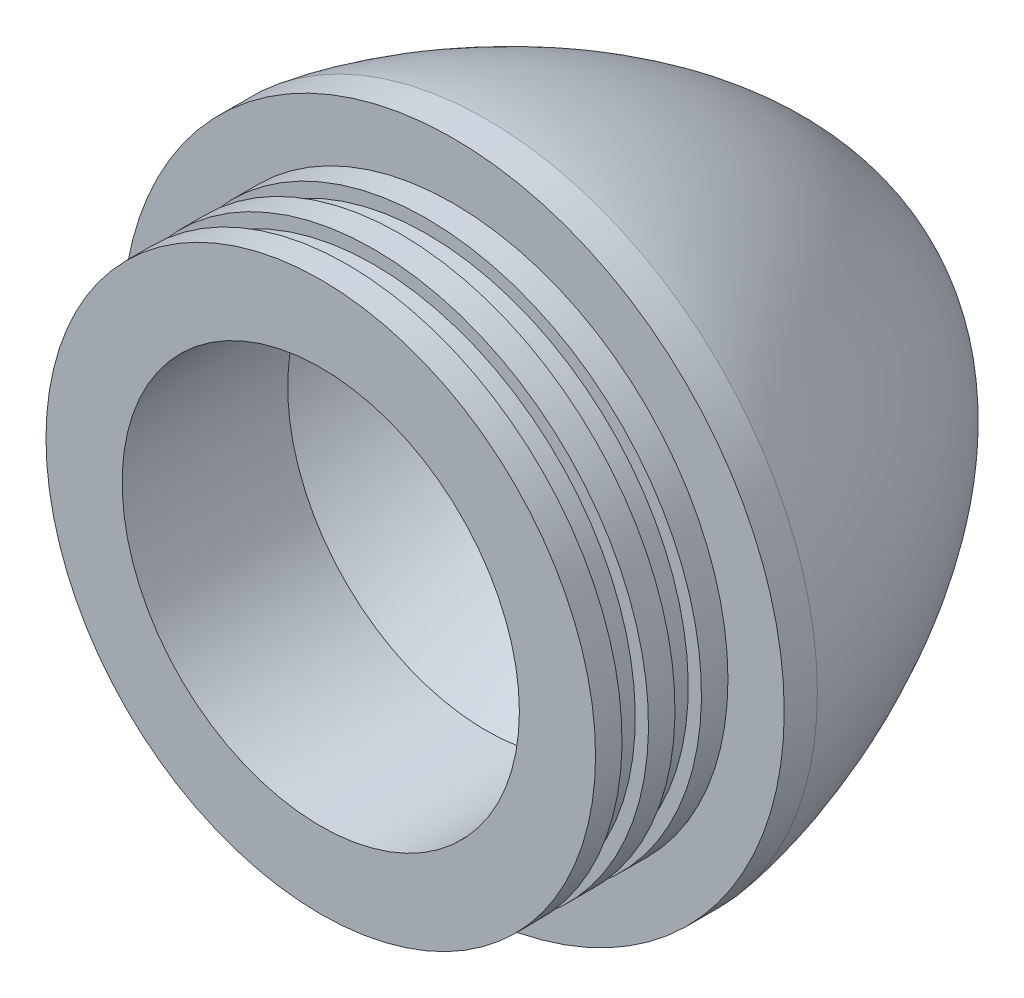
ISO-10303-21;
HEADER;
FILE_DESCRIPTION(('STEP AP214'),'2;1');
FILE_NAME('part.step','',(''),(''),'','','');
FILE_SCHEMA(('AUTOMOTIVE_DESIGN { 1 0 10303 214 1 1 1 1 }'));
ENDSEC;
DATA;
#1=APPLICATION_CONTEXT('core data for automotive mechanical design processes');
#2=APPLICATION_PROTOCOL_DEFINITION('international standard','automotive_design',2000,#1);
#3=PRODUCT_CONTEXT('',#1,'mechanical');
#4=PRODUCT('Part','Part','',(#3));
#5=PRODUCT_RELATED_PRODUCT_CATEGORY('part','',(#4));
#6=PRODUCT_DEFINITION_FORMATION('','',#4);
#7=PRODUCT_DEFINITION_CONTEXT('part definition',#1,'design');
#8=PRODUCT_DEFINITION('design','',#6,#7);
#9=PRODUCT_DEFINITION_SHAPE('','',#8);
#10=(LENGTH_UNIT() NAMED_UNIT(*) SI_UNIT(.MILLI.,.METRE.));
#11=(NAMED_UNIT(*) PLANE_ANGLE_UNIT() SI_UNIT($,.RADIAN.));
#12=(NAMED_UNIT(*) SI_UNIT($,.STERADIAN.) SOLID_ANGLE_UNIT());
#13=UNCERTAINTY_MEASURE_WITH_UNIT(LENGTH_MEASURE(1.E-05),#10,'distance_accuracy_value','');
#14=(GEOMETRIC_REPRESENTATION_CONTEXT(3) GLOBAL_UNCERTAINTY_ASSIGNED_CONTEXT((#13)) GLOBAL_UNIT_ASSIGNED_CONTEXT((#10,
#11,#12)) REPRESENTATION_CONTEXT('',''));
#15=CARTESIAN_POINT('',(0.,0.,0.));
#16=DIRECTION('',(0.,0.,1.));
#17=DIRECTION('',(1.,0.,0.));
#18=AXIS2_PLACEMENT_3D('',#15,#16,#17);
#19=CARTESIAN_POINT('',(0.,0.,25.));
#20=DIRECTION('',(0.,0.,-1.));
#21=DIRECTION('',(-1.,0.,0.));
#22=AXIS2_PLACEMENT_3D('',#19,#20,#21);
#23=CYLINDRICAL_SURFACE('',#22,41.5);
#24=CARTESIAN_POINT('',(0.,0.,9.));
#25=DIRECTION('',(0.,0.,-1.));
#26=DIRECTION('',(0.,1.,0.));
#27=AXIS2_PLACEMENT_3D('',#24,#25,#26);
#28=CIRCLE('',#27,41.5);
#29=CARTESIAN_POINT('',(0.,41.5,9.));
#30=VERTEX_POINT('',#29);
#31=EDGE_CURVE('E105',#30,#30,#28,.T.);
#32=ORIENTED_EDGE('',*,*,#31,.T.);
#33=EDGE_LOOP('',(#32));
#34=FACE_BOUND('',#33,.T.);
#35=CARTESIAN_POINT('',(0.,0.,5.));
#36=DIRECTION('',(0.,0.,1.));
#37=DIRECTION('',(1.,0.,0.));
#38=AXIS2_PLACEMENT_3D('',#35,#36,#37);
#39=CIRCLE('',#38,41.5);
#40=CARTESIAN_POINT('',(41.5,0.,5.));
#41=VERTEX_POINT('',#40);
#42=EDGE_CURVE('E11',#41,#41,#39,.T.);
#43=ORIENTED_EDGE('',*,*,#42,.T.);
#44=EDGE_LOOP('',(#43));
#45=FACE_BOUND('',#44,.T.);
#46=ADVANCED_FACE('F37',(#34,#45),#23,.T.);
#47=CARTESIAN_POINT('',(0.,0.,5.));
#48=DIRECTION('',(0.,0.,-1.));
#49=DIRECTION('',(-1.,0.,0.));
#50=AXIS2_PLACEMENT_3D('',#47,#48,#49);
#51=CYLINDRICAL_SURFACE('',#50,50.);
#52=CARTESIAN_POINT('',(0.,0.,5.));
#53=DIRECTION('',(0.,0.,1.));
#54=DIRECTION('',(1.,0.,0.));
#55=AXIS2_PLACEMENT_3D('',#52,#53,#54);
#56=CIRCLE('',#55,50.);
#57=CARTESIAN_POINT('',(50.,0.,5.));
#58=VERTEX_POINT('',#57);
#59=EDGE_CURVE('E41',#58,#58,#56,.T.);
#60=ORIENTED_EDGE('',*,*,#59,.F.);
#61=EDGE_LOOP('',(#60));
#62=FACE_BOUND('',#61,.T.);
#63=CARTESIAN_POINT('',(0.,0.,1.52273258325249E-12));
#64=DIRECTION('',(0.,0.,1.));
#65=DIRECTION('',(1.,0.,0.));
#66=AXIS2_PLACEMENT_3D('',#63,#64,#65);
#67=CIRCLE('',#66,50.);
#68=CARTESIAN_POINT('',(50.,0.,1.52273258325249E-12));
#69=VERTEX_POINT('',#68);
#70=EDGE_CURVE('E168',#69,#69,#67,.T.);
#71=ORIENTED_EDGE('',*,*,#70,.T.);
#72=EDGE_LOOP('',(#71));
#73=FACE_BOUND('',#72,.T.);
#74=ADVANCED_FACE('F39',(#62,#73),#51,.T.);
#75=CARTESIAN_POINT('',(0.,0.,5.));
#76=DIRECTION('',(0.,0.,1.));
#77=DIRECTION('',(1.,0.,0.));
#78=AXIS2_PLACEMENT_3D('',#75,#76,#77);
#79=PLANE('',#78);
#80=ORIENTED_EDGE('',*,*,#42,.F.);
#81=EDGE_LOOP('',(#80));
#82=FACE_BOUND('',#81,.T.);
#83=ORIENTED_EDGE('',*,*,#59,.T.);
#84=EDGE_LOOP('',(#83));
#85=FACE_BOUND('',#84,.T.);
#86=ADVANCED_FACE('F73',(#82,#85),#79,.T.);
#87=CARTESIAN_POINT('',(0.,0.,0.));
#88=DIRECTION('',(0.,0.,1.));
#89=DIRECTION('',(1.,0.,0.));
#90=AXIS2_PLACEMENT_3D('',#87,#88,#89);
#91=PLANE('',#90);
#92=CARTESIAN_POINT('',(0.,0.,1.4305211884826E-12));
#93=DIRECTION('',(0.,0.,1.));
#94=DIRECTION('',(1.,0.,0.));
#95=AXIS2_PLACEMENT_3D('',#92,#93,#94);
#96=CIRCLE('',#95,46.9721737163812);
#97=CARTESIAN_POINT('',(46.9721737163812,0.,1.4305211884826E-12));
#98=VERTEX_POINT('',#97);
#99=EDGE_CURVE('E165',#98,#98,#96,.T.);
#100=ORIENTED_EDGE('',*,*,#99,.F.);
#101=EDGE_LOOP('',(#100));
#102=FACE_BOUND('',#101,.T.);
#103=CARTESIAN_POINT('',(0.,0.,0.));
#104=DIRECTION('',(0.,0.,1.));
#105=DIRECTION('',(1.,0.,0.));
#106=AXIS2_PLACEMENT_3D('',#103,#104,#105);
#107=CIRCLE('',#106,30.);
#108=CARTESIAN_POINT('',(30.,0.,0.));
#109=VERTEX_POINT('',#108);
#110=EDGE_CURVE('E129',#109,#109,#107,.T.);
#111=ORIENTED_EDGE('',*,*,#110,.T.);
#112=EDGE_LOOP('',(#111));
#113=FACE_BOUND('',#112,.T.);
#114=ADVANCED_FACE('F151',(#102,#113),#91,.F.);
#115=CARTESIAN_POINT('',(0.,41.5,13.));
#116=DIRECTION('',(0.,0.,1.));
#117=DIRECTION('',(0.,-1.,0.));
#118=AXIS2_PLACEMENT_3D('',#115,#116,#117);
#119=PLANE('',#118);
#120=CARTESIAN_POINT('',(0.,0.,13.));
#121=DIRECTION('',(0.,0.,-1.));
#122=DIRECTION('',(0.,1.,0.));
#123=AXIS2_PLACEMENT_3D('',#120,#121,#122);
#124=CIRCLE('',#123,39.5);
#125=CARTESIAN_POINT('',(0.,39.5,13.));
#126=VERTEX_POINT('',#125);
#127=EDGE_CURVE('E114',#126,#126,#124,.T.);
#128=ORIENTED_EDGE('',*,*,#127,.F.);
#129=EDGE_LOOP('',(#128));
#130=FACE_BOUND('',#129,.T.);
#131=CARTESIAN_POINT('',(0.,0.,13.));
#132=DIRECTION('',(0.,0.,-1.));
#133=DIRECTION('',(0.,1.,0.));
#134=AXIS2_PLACEMENT_3D('',#131,#132,#133);
#135=CIRCLE('',#134,41.5);
#136=CARTESIAN_POINT('',(0.,41.5,13.));
#137=VERTEX_POINT('',#136);
#138=EDGE_CURVE('E99',#137,#137,#135,.T.);
#139=ORIENTED_EDGE('',*,*,#138,.T.);
#140=EDGE_LOOP('',(#139));
#141=FACE_BOUND('',#140,.T.);
#142=ADVANCED_FACE('F148',(#130,#141),#119,.F.);
#143=CARTESIAN_POINT('',(0.,0.,0.));
#144=DIRECTION('',(0.,0.,-1.));
#145=DIRECTION('',(0.,1.,0.));
#146=AXIS2_PLACEMENT_3D('',#143,#144,#145);
#147=CYLINDRICAL_SURFACE('',#146,39.5);
#148=CARTESIAN_POINT('',(0.,0.,9.));
#149=DIRECTION('',(0.,0.,-1.));
#150=DIRECTION('',(0.,1.,0.));
#151=AXIS2_PLACEMENT_3D('',#148,#149,#150);
#152=CIRCLE('',#151,39.5);
#153=CARTESIAN_POINT('',(0.,39.5,9.));
#154=VERTEX_POINT('',#153);
#155=EDGE_CURVE('E119',#154,#154,#152,.T.);
#156=ORIENTED_EDGE('',*,*,#155,.F.);
#157=EDGE_LOOP('',(#156));
#158=FACE_BOUND('',#157,.T.);
#159=ORIENTED_EDGE('',*,*,#127,.T.);
#160=EDGE_LOOP('',(#159));
#161=FACE_BOUND('',#160,.T.);
#162=ADVANCED_FACE('F93',(#158,#161),#147,.T.);
#163=CARTESIAN_POINT('',(0.,41.5,9.));
#164=DIRECTION('',(0.,0.,-1.));
#165=DIRECTION('',(0.,1.,0.));
#166=AXIS2_PLACEMENT_3D('',#163,#164,#165);
#167=PLANE('',#166);
#168=ORIENTED_EDGE('',*,*,#31,.F.);
#169=EDGE_LOOP('',(#168));
#170=FACE_BOUND('',#169,.T.);
#171=ORIENTED_EDGE('',*,*,#155,.T.);
#172=EDGE_LOOP('',(#171));
#173=FACE_BOUND('',#172,.T.);
#174=ADVANCED_FACE('F84',(#170,#173),#167,.F.);
#175=ORIENTED_EDGE('',*,*,#138,.F.);
#176=EDGE_LOOP('',(#175));
#177=FACE_BOUND('',#176,.T.);
#178=CARTESIAN_POINT('',(0.,0.,17.));
#179=DIRECTION('',(0.,0.,-1.));
#180=DIRECTION('',(0.,1.,0.));
#181=AXIS2_PLACEMENT_3D('',#178,#179,#180);
#182=CIRCLE('',#181,41.5);
#183=CARTESIAN_POINT('',(0.,41.5,17.));
#184=VERTEX_POINT('',#183);
#185=EDGE_CURVE('E102',#184,#184,#182,.T.);
#186=ORIENTED_EDGE('',*,*,#185,.T.);
#187=EDGE_LOOP('',(#186));
#188=FACE_BOUND('',#187,.T.);
#189=ADVANCED_FACE('F69',(#177,#188),#23,.T.);
#190=CARTESIAN_POINT('',(0.,41.5,17.));
#191=DIRECTION('',(0.,0.,-1.));
#192=DIRECTION('',(0.,1.,0.));
#193=AXIS2_PLACEMENT_3D('',#190,#191,#192);
#194=PLANE('',#193);
#195=ORIENTED_EDGE('',*,*,#185,.F.);
#196=EDGE_LOOP('',(#195));
#197=FACE_BOUND('',#196,.T.);
#198=CARTESIAN_POINT('',(0.,0.,17.));
#199=DIRECTION('',(0.,0.,-1.));
#200=DIRECTION('',(0.,1.,0.));
#201=AXIS2_PLACEMENT_3D('',#198,#199,#200);
#202=CIRCLE('',#201,39.5);
#203=CARTESIAN_POINT('',(0.,39.5,17.));
#204=VERTEX_POINT('',#203);
#205=EDGE_CURVE('E103',#204,#204,#202,.T.);
#206=ORIENTED_EDGE('',*,*,#205,.T.);
#207=EDGE_LOOP('',(#206));
#208=FACE_BOUND('',#207,.T.);
#209=ADVANCED_FACE('F83',(#197,#208),#194,.F.);
#210=CARTESIAN_POINT('',(0.,0.,0.));
#211=DIRECTION('',(0.,0.,-1.));
#212=DIRECTION('',(0.,1.,0.));
#213=AXIS2_PLACEMENT_3D('',#210,#211,#212);
#214=CYLINDRICAL_SURFACE('',#213,39.5);
#215=ORIENTED_EDGE('',*,*,#205,.F.);
#216=EDGE_LOOP('',(#215));
#217=FACE_BOUND('',#216,.T.);
#218=CARTESIAN_POINT('',(0.,0.,21.));
#219=DIRECTION('',(0.,0.,-1.));
#220=DIRECTION('',(0.,1.,0.));
#221=AXIS2_PLACEMENT_3D('',#218,#219,#220);
#222=CIRCLE('',#221,39.5);
#223=CARTESIAN_POINT('',(0.,39.5,21.));
#224=VERTEX_POINT('',#223);
#225=EDGE_CURVE('E108',#224,#224,#222,.T.);
#226=ORIENTED_EDGE('',*,*,#225,.T.);
#227=EDGE_LOOP('',(#226));
#228=FACE_BOUND('',#227,.T.);
#229=ADVANCED_FACE('F90',(#217,#228),#214,.T.);
#230=CARTESIAN_POINT('',(0.,41.5,21.));
#231=DIRECTION('',(0.,0.,1.));
#232=DIRECTION('',(0.,-1.,0.));
#233=AXIS2_PLACEMENT_3D('',#230,#231,#232);
#234=PLANE('',#233);
#235=ORIENTED_EDGE('',*,*,#225,.F.);
#236=EDGE_LOOP('',(#235));
#237=FACE_BOUND('',#236,.T.);
#238=CARTESIAN_POINT('',(0.,0.,21.));
#239=DIRECTION('',(0.,0.,-1.));
#240=DIRECTION('',(0.,1.,0.));
#241=AXIS2_PLACEMENT_3D('',#238,#239,#240);
#242=CIRCLE('',#241,41.5);
#243=CARTESIAN_POINT('',(0.,41.5,21.));
#244=VERTEX_POINT('',#243);
#245=EDGE_CURVE('E127',#244,#244,#242,.T.);
#246=ORIENTED_EDGE('',*,*,#245,.T.);
#247=EDGE_LOOP('',(#246));
#248=FACE_BOUND('',#247,.T.);
#249=ADVANCED_FACE('F134',(#237,#248),#234,.F.);
#250=CARTESIAN_POINT('',(0.,0.,25.));
#251=DIRECTION('',(0.,0.,1.));
#252=DIRECTION('',(1.,0.,0.));
#253=AXIS2_PLACEMENT_3D('',#250,#251,#252);
#254=PLANE('',#253);
#255=CARTESIAN_POINT('',(0.,0.,25.));
#256=DIRECTION('',(0.,0.,1.));
#257=DIRECTION('',(1.,0.,0.));
#258=AXIS2_PLACEMENT_3D('',#255,#256,#257);
#259=CIRCLE('',#258,30.);
#260=CARTESIAN_POINT('',(30.,0.,25.));
#261=VERTEX_POINT('',#260);
#262=EDGE_CURVE('E164',#261,#261,#259,.T.);
#263=ORIENTED_EDGE('',*,*,#262,.F.);
#264=EDGE_LOOP('',(#263));
#265=FACE_BOUND('',#264,.T.);
#266=CARTESIAN_POINT('',(0.,0.,25.));
#267=DIRECTION('',(0.,0.,1.));
#268=DIRECTION('',(1.,0.,0.));
#269=AXIS2_PLACEMENT_3D('',#266,#267,#268);
#270=CIRCLE('',#269,41.5);
#271=CARTESIAN_POINT('',(41.5,0.,25.));
#272=VERTEX_POINT('',#271);
#273=EDGE_CURVE('E112',#272,#272,#270,.T.);
#274=ORIENTED_EDGE('',*,*,#273,.T.);
#275=EDGE_LOOP('',(#274));
#276=FACE_BOUND('',#275,.T.);
#277=ADVANCED_FACE('F80',(#265,#276),#254,.T.);
#278=ORIENTED_EDGE('',*,*,#245,.F.);
#279=EDGE_LOOP('',(#278));
#280=FACE_BOUND('',#279,.T.);
#281=ORIENTED_EDGE('',*,*,#273,.F.);
#282=EDGE_LOOP('',(#281));
#283=FACE_BOUND('',#282,.T.);
#284=ADVANCED_FACE('F68',(#280,#283),#23,.T.);
#285=CARTESIAN_POINT('',(0.,0.,0.));
#286=DIRECTION('',(0.,0.,1.));
#287=DIRECTION('',(1.,0.,0.));
#288=AXIS2_PLACEMENT_3D('',#285,#286,#287);
#289=CYLINDRICAL_SURFACE('',#288,30.);
#290=ORIENTED_EDGE('',*,*,#110,.F.);
#291=EDGE_LOOP('',(#290));
#292=FACE_BOUND('',#291,.T.);
#293=ORIENTED_EDGE('',*,*,#262,.T.);
#294=EDGE_LOOP('',(#293));
#295=FACE_BOUND('',#294,.T.);
#296=ADVANCED_FACE('F59',(#292,#295),#289,.F.);
#297=CARTESIAN_POINT('',(0.,0.,-60.));
#298=CARTESIAN_POINT('',(0.,-30.,-60.0000000000001));
#299=CARTESIAN_POINT('',(0.,-47.5852654439291,-18.3417299354154));
#300=CARTESIAN_POINT('',(0.,-50.,0.));
#301=B_SPLINE_CURVE_WITH_KNOTS('',3,(#297,#298,#299,#300),.UNSPECIFIED.,.F.,.F.,(4,4),(0.,1.),.UNSPECIFIED.);
#302=CARTESIAN_POINT('',(0.,0.,0.));
#303=DIRECTION('',(0.,0.,1.));
#304=AXIS1_PLACEMENT('',#302,#303);
#305=SURFACE_OF_REVOLUTION('',#301,#304);
#306=ORIENTED_EDGE('',*,*,#70,.F.);
#307=EDGE_LOOP('',(#306));
#308=FACE_BOUND('',#307,.T.);
#309=CARTESIAN_POINT('',(0.,2.22044604925031E-13,-60.));
#310=VERTEX_POINT('',#309);
#311=VERTEX_LOOP('',#310);
#312=FACE_BOUND('',#311,.T.);
#313=ADVANCED_FACE('F53',(#308,#312),#305,.T.);
#314=CARTESIAN_POINT('',(0.,0.,-57.));
#315=CARTESIAN_POINT('',(0.,-0.83952925119945,-57.));
#316=CARTESIAN_POINT('',(0.,-2.53269779864468,-56.926216151113));
#317=CARTESIAN_POINT('',(0.,-5.78734851316487,-56.498585905854));
#318=CARTESIAN_POINT('',(0.,-9.7107854159779,-55.4643845808201));
#319=CARTESIAN_POINT('',(0.,-14.183558612899,-53.4927575248134));
#320=CARTESIAN_POINT('',(0.,-19.8481306162255,-49.9781935800154));
#321=CARTESIAN_POINT('',(0.,-26.3375603305504,-44.1031568804279));
#322=CARTESIAN_POINT('',(0.,-33.0450539165547,-35.370011046317));
#323=CARTESIAN_POINT('',(0.,-37.6403904566596,-27.3284821536489));
#324=CARTESIAN_POINT('',(0.,-40.6816173717833,-20.8296908823111));
#325=CARTESIAN_POINT('',(0.,-42.6374775948696,-16.0221939948621));
#326=CARTESIAN_POINT('',(0.,-44.2613118390939,-11.381613040892));
#327=CARTESIAN_POINT('',(0.,-45.3327021644147,-7.73844922670409));
#328=CARTESIAN_POINT('',(0.,-46.017990598731,-5.01181959382676));
#329=CARTESIAN_POINT('',(0.,-46.445655401171,-3.07368842828038));
#330=CARTESIAN_POINT('',(0.,-46.7292878570308,-1.56355107912511));
#331=CARTESIAN_POINT('',(0.,-46.8857196400888,-0.591183995002918));
#332=CARTESIAN_POINT('',(0.,-46.9522778987601,-0.140951316269452));
#333=CARTESIAN_POINT('',(0.,-46.9909575903397,0.132531807532808));
#334=CARTESIAN_POINT('',(0.,-47.0126040556491,0.29236769597951));
#335=CARTESIAN_POINT('',(0.,-47.0256654158786,0.391578576660169));
#336=B_SPLINE_CURVE_WITH_KNOTS('',3,(#314,#315,#316,#317,#318,#319,#320,#321,#322,#323,#324,
#325,#326,#327,#328,#329,#330,#331,#332,#333,#334,#335),.UNSPECIFIED.,.F.,.F.,(4,1,1,1,1,1,1,1,
1,1,1,1,1,1,1,1,1,1,1,4),(0.,0.03125,0.0625,0.125,0.1875,0.25,0.375,0.5,0.625,0.6875,0.75,
0.8125,0.875,0.90625,0.9375,0.96875,0.984375,0.990544400507563,0.994326640304538,1.),.UNSPECIFIED.);
#337=CARTESIAN_POINT('',(0.,0.,0.));
#338=DIRECTION('',(0.,0.,1.));
#339=AXIS1_PLACEMENT('',#337,#338);
#340=SURFACE_OF_REVOLUTION('',#336,#339);
#341=ORIENTED_EDGE('',*,*,#99,.T.);
#342=EDGE_LOOP('',(#341));
#343=FACE_BOUND('',#342,.T.);
#344=CARTESIAN_POINT('',(0.,2.10942374678779E-13,-57.));
#345=VERTEX_POINT('',#344);
#346=VERTEX_LOOP('',#345);
#347=FACE_BOUND('',#346,.T.);
#348=ADVANCED_FACE('F51',(#343,#347),#340,.F.);
#349=CLOSED_SHELL('',(#46,#74,#86,#114,#142,#162,#174,#189,#209,#229,#249,#277,#284,#296,#313,#348));
#350=MANIFOLD_SOLID_BREP('B2',#349);
#351=ADVANCED_BREP_SHAPE_REPRESENTATION('',(#18,#350),#14);
#352=SHAPE_DEFINITION_REPRESENTATION(#9,#351);
ENDSEC;
END-ISO-10303-21;
